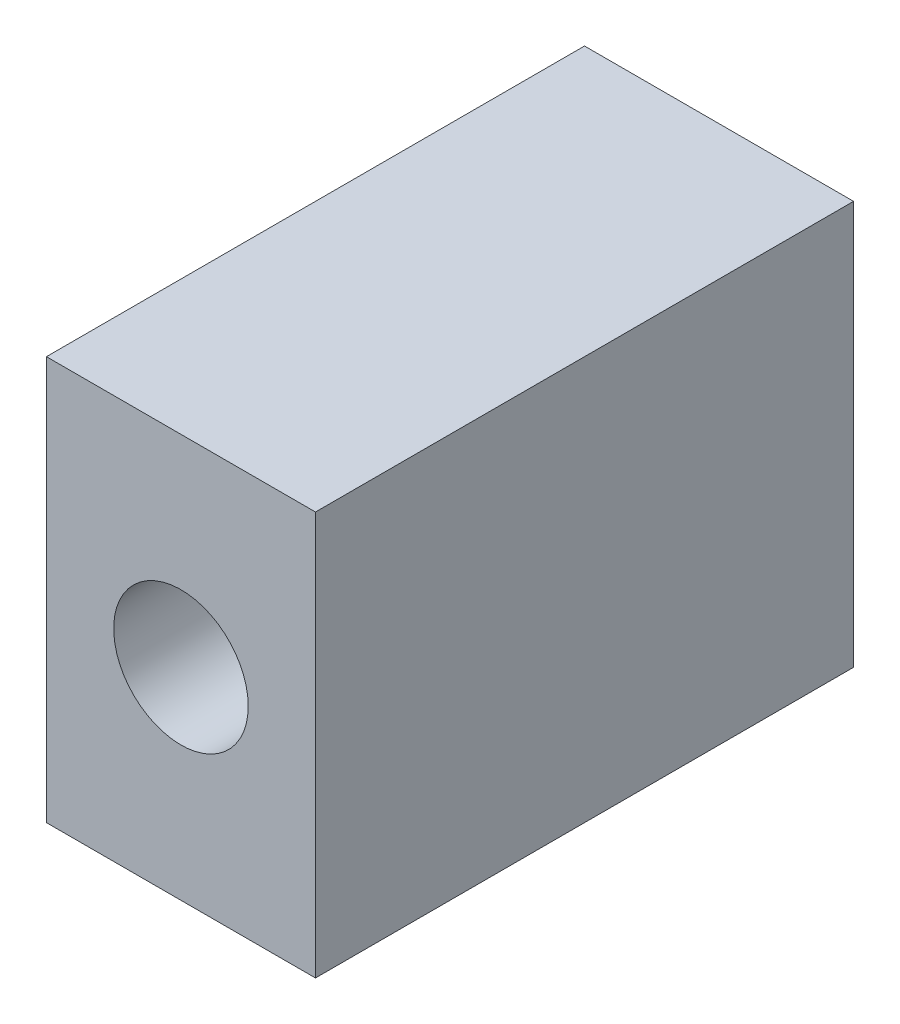
ISO-10303-21;
HEADER;
FILE_DESCRIPTION(('STEP AP214'),'2;1');
FILE_NAME('part.step','',(''),(''),'','','');
FILE_SCHEMA(('AUTOMOTIVE_DESIGN { 1 0 10303 214 1 1 1 1 }'));
ENDSEC;
DATA;
#1=APPLICATION_CONTEXT('core data for automotive mechanical design processes');
#2=APPLICATION_PROTOCOL_DEFINITION('international standard','automotive_design',2000,#1);
#3=PRODUCT_CONTEXT('',#1,'mechanical');
#4=PRODUCT('Part','Part','',(#3));
#5=PRODUCT_RELATED_PRODUCT_CATEGORY('part','',(#4));
#6=PRODUCT_DEFINITION_FORMATION('','',#4);
#7=PRODUCT_DEFINITION_CONTEXT('part definition',#1,'design');
#8=PRODUCT_DEFINITION('design','',#6,#7);
#9=PRODUCT_DEFINITION_SHAPE('','',#8);
#10=(LENGTH_UNIT() NAMED_UNIT(*) SI_UNIT(.MILLI.,.METRE.));
#11=(NAMED_UNIT(*) PLANE_ANGLE_UNIT() SI_UNIT($,.RADIAN.));
#12=(NAMED_UNIT(*) SI_UNIT($,.STERADIAN.) SOLID_ANGLE_UNIT());
#13=UNCERTAINTY_MEASURE_WITH_UNIT(LENGTH_MEASURE(1.E-05),#10,'distance_accuracy_value','');
#14=(GEOMETRIC_REPRESENTATION_CONTEXT(3) GLOBAL_UNCERTAINTY_ASSIGNED_CONTEXT((#13)) GLOBAL_UNIT_ASSIGNED_CONTEXT((#10,
#11,#12)) REPRESENTATION_CONTEXT('',''));
#15=CARTESIAN_POINT('',(0.,0.,0.));
#16=DIRECTION('',(0.,0.,1.));
#17=DIRECTION('',(1.,0.,0.));
#18=AXIS2_PLACEMENT_3D('',#15,#16,#17);
#19=CARTESIAN_POINT('',(0.,30.,40.));
#20=DIRECTION('',(1.,0.,0.));
#21=DIRECTION('',(0.,0.,-1.));
#22=AXIS2_PLACEMENT_3D('',#19,#20,#21);
#23=PLANE('',#22);
#24=DIRECTION('',(0.,-1.,0.));
#25=VECTOR('',#24,1.);
#26=CARTESIAN_POINT('',(0.,30.,0.));
#27=LINE('',#26,#25);
#28=CARTESIAN_POINT('',(0.,30.,0.));
#29=VERTEX_POINT('',#28);
#30=CARTESIAN_POINT('',(0.,0.,0.));
#31=VERTEX_POINT('',#30);
#32=EDGE_CURVE('E106',#29,#31,#27,.T.);
#33=ORIENTED_EDGE('',*,*,#32,.T.);
#34=DIRECTION('',(0.,0.,-1.));
#35=VECTOR('',#34,1.);
#36=CARTESIAN_POINT('',(0.,0.,40.));
#37=LINE('',#36,#35);
#38=CARTESIAN_POINT('',(0.,0.,40.));
#39=VERTEX_POINT('',#38);
#40=EDGE_CURVE('E11',#39,#31,#37,.T.);
#41=ORIENTED_EDGE('',*,*,#40,.F.);
#42=DIRECTION('',(0.,-1.,0.));
#43=VECTOR('',#42,1.);
#44=CARTESIAN_POINT('',(0.,30.,40.));
#45=LINE('',#44,#43);
#46=CARTESIAN_POINT('',(0.,30.,40.));
#47=VERTEX_POINT('',#46);
#48=EDGE_CURVE('E94',#47,#39,#45,.T.);
#49=ORIENTED_EDGE('',*,*,#48,.F.);
#50=DIRECTION('',(0.,0.,-1.));
#51=VECTOR('',#50,1.);
#52=CARTESIAN_POINT('',(0.,30.,40.));
#53=LINE('',#52,#51);
#54=EDGE_CURVE('E102',#47,#29,#53,.T.);
#55=ORIENTED_EDGE('',*,*,#54,.T.);
#56=EDGE_LOOP('',(#33,#41,#49,#55));
#57=FACE_BOUND('',#56,.T.);
#58=ADVANCED_FACE('F43',(#57),#23,.F.);
#59=CARTESIAN_POINT('',(0.,0.,40.));
#60=DIRECTION('',(0.,1.,0.));
#61=DIRECTION('',(0.,0.,1.));
#62=AXIS2_PLACEMENT_3D('',#59,#60,#61);
#63=PLANE('',#62);
#64=DIRECTION('',(1.,0.,0.));
#65=VECTOR('',#64,1.);
#66=CARTESIAN_POINT('',(0.,0.,0.));
#67=LINE('',#66,#65);
#68=CARTESIAN_POINT('',(20.,0.,0.));
#69=VERTEX_POINT('',#68);
#70=EDGE_CURVE('E98',#31,#69,#67,.T.);
#71=ORIENTED_EDGE('',*,*,#70,.T.);
#72=DIRECTION('',(0.,0.,-1.));
#73=VECTOR('',#72,1.);
#74=CARTESIAN_POINT('',(20.,0.,40.));
#75=LINE('',#74,#73);
#76=CARTESIAN_POINT('',(20.,0.,40.));
#77=VERTEX_POINT('',#76);
#78=EDGE_CURVE('E51',#77,#69,#75,.T.);
#79=ORIENTED_EDGE('',*,*,#78,.F.);
#80=DIRECTION('',(1.,0.,0.));
#81=VECTOR('',#80,1.);
#82=CARTESIAN_POINT('',(0.,0.,40.));
#83=LINE('',#82,#81);
#84=EDGE_CURVE('E89',#39,#77,#83,.T.);
#85=ORIENTED_EDGE('',*,*,#84,.F.);
#86=ORIENTED_EDGE('',*,*,#40,.T.);
#87=EDGE_LOOP('',(#71,#79,#85,#86));
#88=FACE_BOUND('',#87,.T.);
#89=ADVANCED_FACE('F97',(#88),#63,.F.);
#90=CARTESIAN_POINT('',(20.,0.,40.));
#91=DIRECTION('',(-1.,0.,0.));
#92=DIRECTION('',(0.,0.,1.));
#93=AXIS2_PLACEMENT_3D('',#90,#91,#92);
#94=PLANE('',#93);
#95=DIRECTION('',(0.,1.,0.));
#96=VECTOR('',#95,1.);
#97=CARTESIAN_POINT('',(20.,0.,0.));
#98=LINE('',#97,#96);
#99=CARTESIAN_POINT('',(20.,30.,0.));
#100=VERTEX_POINT('',#99);
#101=EDGE_CURVE('E76',#69,#100,#98,.T.);
#102=ORIENTED_EDGE('',*,*,#101,.T.);
#103=DIRECTION('',(0.,0.,-1.));
#104=VECTOR('',#103,1.);
#105=CARTESIAN_POINT('',(20.,30.,40.));
#106=LINE('',#105,#104);
#107=CARTESIAN_POINT('',(20.,30.,40.));
#108=VERTEX_POINT('',#107);
#109=EDGE_CURVE('E99',#108,#100,#106,.T.);
#110=ORIENTED_EDGE('',*,*,#109,.F.);
#111=DIRECTION('',(0.,1.,0.));
#112=VECTOR('',#111,1.);
#113=CARTESIAN_POINT('',(20.,0.,40.));
#114=LINE('',#113,#112);
#115=EDGE_CURVE('E92',#77,#108,#114,.T.);
#116=ORIENTED_EDGE('',*,*,#115,.F.);
#117=ORIENTED_EDGE('',*,*,#78,.T.);
#118=EDGE_LOOP('',(#102,#110,#116,#117));
#119=FACE_BOUND('',#118,.T.);
#120=ADVANCED_FACE('F100',(#119),#94,.F.);
#121=CARTESIAN_POINT('',(20.,30.,40.));
#122=DIRECTION('',(0.,-1.,0.));
#123=DIRECTION('',(0.,0.,-1.));
#124=AXIS2_PLACEMENT_3D('',#121,#122,#123);
#125=PLANE('',#124);
#126=DIRECTION('',(-1.,0.,0.));
#127=VECTOR('',#126,1.);
#128=CARTESIAN_POINT('',(20.,30.,0.));
#129=LINE('',#128,#127);
#130=EDGE_CURVE('E82',#100,#29,#129,.T.);
#131=ORIENTED_EDGE('',*,*,#130,.T.);
#132=ORIENTED_EDGE('',*,*,#54,.F.);
#133=DIRECTION('',(-1.,0.,0.));
#134=VECTOR('',#133,1.);
#135=CARTESIAN_POINT('',(20.,30.,40.));
#136=LINE('',#135,#134);
#137=EDGE_CURVE('E59',#108,#47,#136,.T.);
#138=ORIENTED_EDGE('',*,*,#137,.F.);
#139=ORIENTED_EDGE('',*,*,#109,.T.);
#140=EDGE_LOOP('',(#131,#132,#138,#139));
#141=FACE_BOUND('',#140,.T.);
#142=ADVANCED_FACE('F114',(#141),#125,.F.);
#143=CARTESIAN_POINT('',(0.,0.,40.));
#144=DIRECTION('',(0.,0.,1.));
#145=DIRECTION('',(1.,0.,0.));
#146=AXIS2_PLACEMENT_3D('',#143,#144,#145);
#147=PLANE('',#146);
#148=CARTESIAN_POINT('',(10.,15.,40.));
#149=DIRECTION('',(0.,0.,1.));
#150=DIRECTION('',(1.,0.,0.));
#151=AXIS2_PLACEMENT_3D('',#148,#149,#150);
#152=CIRCLE('',#151,5.);
#153=CARTESIAN_POINT('',(15.,15.,40.));
#154=VERTEX_POINT('',#153);
#155=EDGE_CURVE('E120',#154,#154,#152,.T.);
#156=ORIENTED_EDGE('',*,*,#155,.F.);
#157=EDGE_LOOP('',(#156));
#158=FACE_BOUND('',#157,.T.);
#159=ORIENTED_EDGE('',*,*,#48,.T.);
#160=ORIENTED_EDGE('',*,*,#84,.T.);
#161=ORIENTED_EDGE('',*,*,#115,.T.);
#162=ORIENTED_EDGE('',*,*,#137,.T.);
#163=EDGE_LOOP('',(#159,#160,#161,#162));
#164=FACE_BOUND('',#163,.T.);
#165=ADVANCED_FACE('F90',(#158,#164),#147,.T.);
#166=CARTESIAN_POINT('',(0.,0.,0.));
#167=DIRECTION('',(0.,0.,1.));
#168=DIRECTION('',(1.,0.,0.));
#169=AXIS2_PLACEMENT_3D('',#166,#167,#168);
#170=PLANE('',#169);
#171=CARTESIAN_POINT('',(10.,15.,0.));
#172=DIRECTION('',(0.,0.,1.));
#173=DIRECTION('',(1.,0.,0.));
#174=AXIS2_PLACEMENT_3D('',#171,#172,#173);
#175=CIRCLE('',#174,5.);
#176=CARTESIAN_POINT('',(15.,15.,0.));
#177=VERTEX_POINT('',#176);
#178=EDGE_CURVE('E109',#177,#177,#175,.T.);
#179=ORIENTED_EDGE('',*,*,#178,.T.);
#180=EDGE_LOOP('',(#179));
#181=FACE_BOUND('',#180,.T.);
#182=ORIENTED_EDGE('',*,*,#32,.F.);
#183=ORIENTED_EDGE('',*,*,#130,.F.);
#184=ORIENTED_EDGE('',*,*,#101,.F.);
#185=ORIENTED_EDGE('',*,*,#70,.F.);
#186=EDGE_LOOP('',(#182,#183,#184,#185));
#187=FACE_BOUND('',#186,.T.);
#188=ADVANCED_FACE('F117',(#181,#187),#170,.F.);
#189=CARTESIAN_POINT('',(10.,15.,0.));
#190=DIRECTION('',(0.,0.,1.));
#191=DIRECTION('',(1.,0.,0.));
#192=AXIS2_PLACEMENT_3D('',#189,#190,#191);
#193=CYLINDRICAL_SURFACE('',#192,5.);
#194=ORIENTED_EDGE('',*,*,#178,.F.);
#195=EDGE_LOOP('',(#194));
#196=FACE_BOUND('',#195,.T.);
#197=ORIENTED_EDGE('',*,*,#155,.T.);
#198=EDGE_LOOP('',(#197));
#199=FACE_BOUND('',#198,.T.);
#200=ADVANCED_FACE('F127',(#196,#199),#193,.F.);
#201=CLOSED_SHELL('',(#58,#89,#120,#142,#165,#188,#200));
#202=MANIFOLD_SOLID_BREP('B2',#201);
#203=ADVANCED_BREP_SHAPE_REPRESENTATION('',(#18,#202),#14);
#204=SHAPE_DEFINITION_REPRESENTATION(#9,#203);
ENDSEC;
END-ISO-10303-21;
